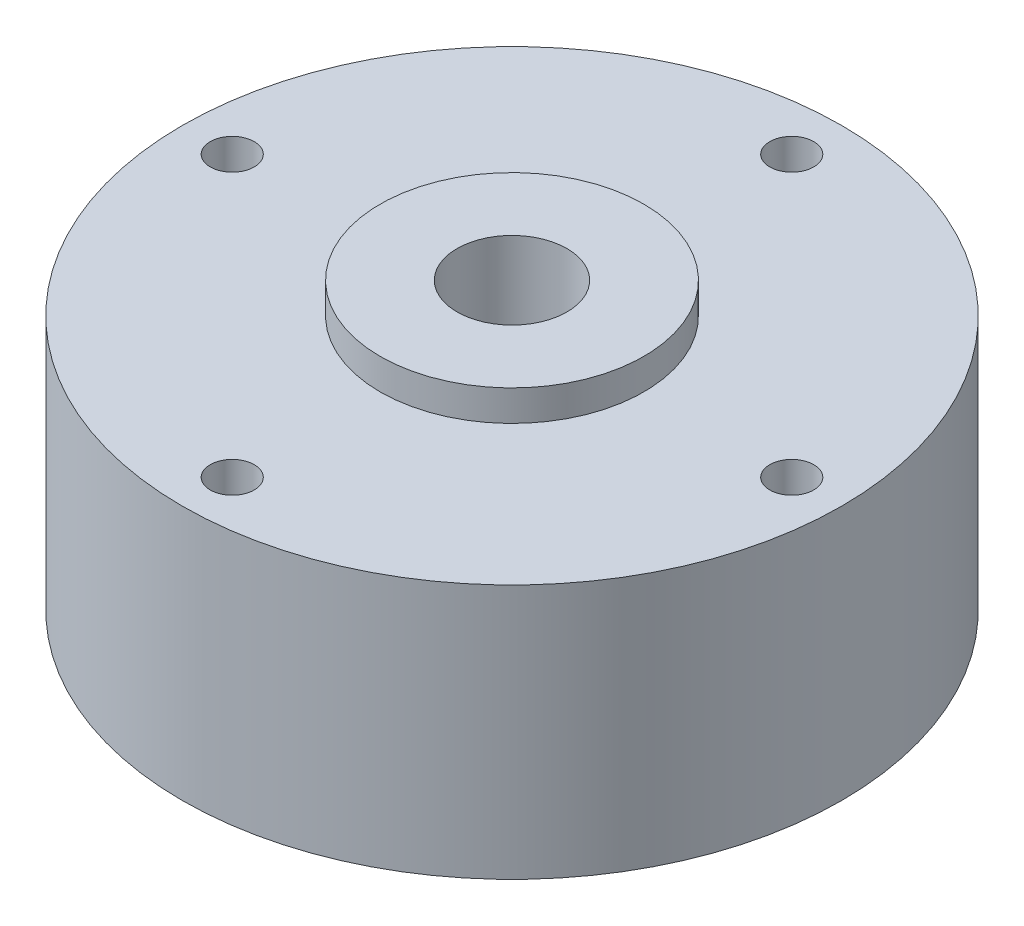
ISO-10303-21;
HEADER;
FILE_DESCRIPTION(('STEP AP214'),'2;1');
FILE_NAME('part.step','',(''),(''),'','','');
FILE_SCHEMA(('AUTOMOTIVE_DESIGN { 1 0 10303 214 1 1 1 1 }'));
ENDSEC;
DATA;
#1=APPLICATION_CONTEXT('core data for automotive mechanical design processes');
#2=APPLICATION_PROTOCOL_DEFINITION('international standard','automotive_design',2000,#1);
#3=PRODUCT_CONTEXT('',#1,'mechanical');
#4=PRODUCT('Part','Part','',(#3));
#5=PRODUCT_RELATED_PRODUCT_CATEGORY('part','',(#4));
#6=PRODUCT_DEFINITION_FORMATION('','',#4);
#7=PRODUCT_DEFINITION_CONTEXT('part definition',#1,'design');
#8=PRODUCT_DEFINITION('design','',#6,#7);
#9=PRODUCT_DEFINITION_SHAPE('','',#8);
#10=(LENGTH_UNIT() NAMED_UNIT(*) SI_UNIT(.MILLI.,.METRE.));
#11=(NAMED_UNIT(*) PLANE_ANGLE_UNIT() SI_UNIT($,.RADIAN.));
#12=(NAMED_UNIT(*) SI_UNIT($,.STERADIAN.) SOLID_ANGLE_UNIT());
#13=UNCERTAINTY_MEASURE_WITH_UNIT(LENGTH_MEASURE(1.E-05),#10,'distance_accuracy_value','');
#14=(GEOMETRIC_REPRESENTATION_CONTEXT(3) GLOBAL_UNCERTAINTY_ASSIGNED_CONTEXT((#13)) GLOBAL_UNIT_ASSIGNED_CONTEXT((#10,
#11,#12)) REPRESENTATION_CONTEXT('',''));
#15=CARTESIAN_POINT('',(0.,0.,0.));
#16=DIRECTION('',(0.,0.,1.));
#17=DIRECTION('',(1.,0.,0.));
#18=AXIS2_PLACEMENT_3D('',#15,#16,#17);
#19=CARTESIAN_POINT('',(0.,13.,0.));
#20=DIRECTION('',(0.,-1.,0.));
#21=DIRECTION('',(0.,0.,-1.));
#22=AXIS2_PLACEMENT_3D('',#19,#20,#21);
#23=CYLINDRICAL_SURFACE('',#22,15.);
#24=CARTESIAN_POINT('',(0.,0.,0.));
#25=DIRECTION('',(0.,1.,0.));
#26=DIRECTION('',(0.,0.,1.));
#27=AXIS2_PLACEMENT_3D('',#24,#25,#26);
#28=CIRCLE('',#27,15.);
#29=CARTESIAN_POINT('',(0.,0.,-15.));
#30=VERTEX_POINT('',#29);
#31=EDGE_CURVE('E10',#30,#30,#28,.T.);
#32=CARTESIAN_POINT('',(0.,11.6,0.));
#33=DIRECTION('',(0.,1.,0.));
#34=DIRECTION('',(0.,0.,1.));
#35=AXIS2_PLACEMENT_3D('',#32,#33,#34);
#36=CIRCLE('',#35,15.);
#37=CARTESIAN_POINT('',(0.,11.6,-15.));
#38=VERTEX_POINT('',#37);
#39=EDGE_CURVE('E40',#38,#38,#36,.T.);
#40=CARTESIAN_POINT('',(0.,0.,-15.));
#41=CARTESIAN_POINT('',(0.,0.120833333333333,-15.));
#42=CARTESIAN_POINT('',(0.,0.241666666666667,-15.));
#43=CARTESIAN_POINT('',(0.,0.483333333333333,-15.));
#44=CARTESIAN_POINT('',(0.,0.604166666666667,-15.));
#45=CARTESIAN_POINT('',(0.,0.845833333333333,-15.));
#46=CARTESIAN_POINT('',(0.,0.966666666666667,-15.));
#47=CARTESIAN_POINT('',(0.,1.20833333333333,-15.));
#48=CARTESIAN_POINT('',(0.,1.32916666666667,-15.));
#49=CARTESIAN_POINT('',(0.,1.57083333333333,-15.));
#50=CARTESIAN_POINT('',(0.,1.69166666666667,-15.));
#51=CARTESIAN_POINT('',(0.,1.93333333333333,-15.));
#52=CARTESIAN_POINT('',(0.,2.05416666666667,-15.));
#53=CARTESIAN_POINT('',(0.,2.29583333333333,-15.));
#54=CARTESIAN_POINT('',(0.,2.41666666666667,-15.));
#55=CARTESIAN_POINT('',(0.,2.65833333333333,-15.));
#56=CARTESIAN_POINT('',(0.,2.77916666666667,-15.));
#57=CARTESIAN_POINT('',(0.,3.02083333333333,-15.));
#58=CARTESIAN_POINT('',(0.,3.14166666666667,-15.));
#59=CARTESIAN_POINT('',(0.,3.38333333333333,-15.));
#60=CARTESIAN_POINT('',(0.,3.50416666666667,-15.));
#61=CARTESIAN_POINT('',(0.,3.74583333333333,-15.));
#62=CARTESIAN_POINT('',(0.,3.86666666666667,-15.));
#63=CARTESIAN_POINT('',(0.,4.10833333333333,-15.));
#64=CARTESIAN_POINT('',(0.,4.22916666666667,-15.));
#65=CARTESIAN_POINT('',(0.,4.47083333333333,-15.));
#66=CARTESIAN_POINT('',(0.,4.59166666666667,-15.));
#67=CARTESIAN_POINT('',(0.,4.83333333333333,-15.));
#68=CARTESIAN_POINT('',(0.,4.95416666666667,-15.));
#69=CARTESIAN_POINT('',(0.,5.19583333333333,-15.));
#70=CARTESIAN_POINT('',(0.,5.31666666666667,-15.));
#71=CARTESIAN_POINT('',(0.,5.55833333333333,-15.));
#72=CARTESIAN_POINT('',(0.,5.67916666666667,-15.));
#73=CARTESIAN_POINT('',(0.,5.92083333333333,-15.));
#74=CARTESIAN_POINT('',(0.,6.04166666666667,-15.));
#75=CARTESIAN_POINT('',(0.,6.28333333333333,-15.));
#76=CARTESIAN_POINT('',(0.,6.40416666666667,-15.));
#77=CARTESIAN_POINT('',(0.,6.64583333333333,-15.));
#78=CARTESIAN_POINT('',(0.,6.76666666666667,-15.));
#79=CARTESIAN_POINT('',(0.,7.00833333333333,-15.));
#80=CARTESIAN_POINT('',(0.,7.12916666666667,-15.));
#81=CARTESIAN_POINT('',(0.,7.37083333333333,-15.));
#82=CARTESIAN_POINT('',(0.,7.49166666666667,-15.));
#83=CARTESIAN_POINT('',(0.,7.73333333333333,-15.));
#84=CARTESIAN_POINT('',(0.,7.85416666666667,-15.));
#85=CARTESIAN_POINT('',(0.,8.09583333333333,-15.));
#86=CARTESIAN_POINT('',(0.,8.21666666666667,-15.));
#87=CARTESIAN_POINT('',(0.,8.45833333333333,-15.));
#88=CARTESIAN_POINT('',(0.,8.57916666666667,-15.));
#89=CARTESIAN_POINT('',(0.,8.82083333333333,-15.));
#90=CARTESIAN_POINT('',(0.,8.94166666666666,-15.));
#91=CARTESIAN_POINT('',(0.,9.18333333333333,-15.));
#92=CARTESIAN_POINT('',(0.,9.30416666666666,-15.));
#93=CARTESIAN_POINT('',(0.,9.54583333333333,-15.));
#94=CARTESIAN_POINT('',(0.,9.66666666666666,-15.));
#95=CARTESIAN_POINT('',(0.,9.90833333333333,-15.));
#96=CARTESIAN_POINT('',(0.,10.0291666666667,-15.));
#97=CARTESIAN_POINT('',(0.,10.2708333333333,-15.));
#98=CARTESIAN_POINT('',(0.,10.3916666666667,-15.));
#99=CARTESIAN_POINT('',(0.,10.6333333333333,-15.));
#100=CARTESIAN_POINT('',(0.,10.7541666666667,-15.));
#101=CARTESIAN_POINT('',(0.,10.9958333333333,-15.));
#102=CARTESIAN_POINT('',(0.,11.1166666666667,-15.));
#103=CARTESIAN_POINT('',(0.,11.3583333333333,-15.));
#104=CARTESIAN_POINT('',(0.,11.4791666666667,-15.));
#105=CARTESIAN_POINT('',(0.,11.6,-15.));
#106=B_SPLINE_CURVE_WITH_KNOTS('',3,(#40,#41,#42,#43,#44,#45,#46,#47,#48,#49,#50,#51,#52,#53,
#54,#55,#56,#57,#58,#59,#60,#61,#62,#63,#64,#65,#66,#67,#68,#69,#70,#71,#72,#73,#74,#75,#76,#77,
#78,#79,#80,#81,#82,#83,#84,#85,#86,#87,#88,#89,#90,#91,#92,#93,#94,#95,#96,#97,#98,#99,#100,
#101,#102,#103,#104,#105),.UNSPECIFIED.,.F.,.F.,(4,2,2,2,2,2,2,2,2,2,2,2,2,2,2,2,2,2,2,2,2,2,2,
2,2,2,2,2,2,2,2,2,4),(0.,0.3625,0.725,1.0875,1.45,1.8125,2.175,2.5375,2.9,3.2625,3.625,3.9875,
4.35,4.7125,5.075,5.4375,5.8,6.1625,6.525,6.8875,7.25,7.6125,7.975,8.3375,8.7,9.0625,9.425,
9.7875,10.15,10.5125,10.875,11.2375,11.6),.UNSPECIFIED.);
#107=EDGE_CURVE('BSEAM33',#30,#38,#106,.T.);
#108=ORIENTED_EDGE('',*,*,#31,.T.);
#109=ORIENTED_EDGE('',*,*,#39,.F.);
#110=ORIENTED_EDGE('',*,*,#107,.T.);
#111=ORIENTED_EDGE('',*,*,#107,.F.);
#112=EDGE_LOOP('',(#108,#110,#109,#111));
#113=FACE_BOUND('',#112,.T.);
#114=ADVANCED_FACE('F33',(#113),#23,.T.);
#115=CARTESIAN_POINT('',(0.,0.,0.));
#116=DIRECTION('',(0.,1.,0.));
#117=DIRECTION('',(0.,0.,1.));
#118=AXIS2_PLACEMENT_3D('',#115,#116,#117);
#119=PLANE('',#118);
#120=CARTESIAN_POINT('',(0.,0.,0.));
#121=DIRECTION('',(0.,-1.,0.));
#122=DIRECTION('',(0.,0.,-1.));
#123=AXIS2_PLACEMENT_3D('',#120,#121,#122);
#124=CIRCLE('',#123,2.5);
#125=CARTESIAN_POINT('',(0.,0.,-2.5));
#126=VERTEX_POINT('',#125);
#127=EDGE_CURVE('E105',#126,#126,#124,.T.);
#128=ORIENTED_EDGE('',*,*,#127,.F.);
#129=EDGE_LOOP('',(#128));
#130=FACE_BOUND('',#129,.T.);
#131=CARTESIAN_POINT('',(-11.,0.,-5.));
#132=DIRECTION('',(0.,-1.,0.));
#133=DIRECTION('',(0.,0.,-1.));
#134=AXIS2_PLACEMENT_3D('',#131,#132,#133);
#135=CIRCLE('',#134,1.);
#136=CARTESIAN_POINT('',(-11.,0.,-6.));
#137=VERTEX_POINT('',#136);
#138=EDGE_CURVE('E87',#137,#137,#135,.T.);
#139=ORIENTED_EDGE('',*,*,#138,.F.);
#140=EDGE_LOOP('',(#139));
#141=FACE_BOUND('',#140,.T.);
#142=CARTESIAN_POINT('',(11.,0.,-5.));
#143=DIRECTION('',(0.,-1.,0.));
#144=DIRECTION('',(0.,0.,-1.));
#145=AXIS2_PLACEMENT_3D('',#142,#143,#144);
#146=CIRCLE('',#145,1.);
#147=CARTESIAN_POINT('',(11.,0.,-6.));
#148=VERTEX_POINT('',#147);
#149=EDGE_CURVE('E94',#148,#148,#146,.T.);
#150=ORIENTED_EDGE('',*,*,#149,.F.);
#151=EDGE_LOOP('',(#150));
#152=FACE_BOUND('',#151,.T.);
#153=CARTESIAN_POINT('',(11.,0.,5.));
#154=DIRECTION('',(0.,-1.,0.));
#155=DIRECTION('',(0.,0.,-1.));
#156=AXIS2_PLACEMENT_3D('',#153,#154,#155);
#157=CIRCLE('',#156,1.);
#158=CARTESIAN_POINT('',(11.,0.,4.));
#159=VERTEX_POINT('',#158);
#160=EDGE_CURVE('E100',#159,#159,#157,.T.);
#161=ORIENTED_EDGE('',*,*,#160,.F.);
#162=EDGE_LOOP('',(#161));
#163=FACE_BOUND('',#162,.T.);
#164=CARTESIAN_POINT('',(-11.,0.,5.));
#165=DIRECTION('',(0.,-1.,0.));
#166=DIRECTION('',(0.,0.,-1.));
#167=AXIS2_PLACEMENT_3D('',#164,#165,#166);
#168=CIRCLE('',#167,1.);
#169=CARTESIAN_POINT('',(-11.,0.,4.));
#170=VERTEX_POINT('',#169);
#171=EDGE_CURVE('E81',#170,#170,#168,.T.);
#172=ORIENTED_EDGE('',*,*,#171,.F.);
#173=EDGE_LOOP('',(#172));
#174=FACE_BOUND('',#173,.T.);
#175=ORIENTED_EDGE('',*,*,#31,.F.);
#176=EDGE_LOOP('',(#175));
#177=FACE_BOUND('',#176,.T.);
#178=ADVANCED_FACE('F120',(#130,#141,#152,#163,#174,#177),#119,.F.);
#179=CARTESIAN_POINT('',(0.,11.6,0.));
#180=DIRECTION('',(0.,1.,0.));
#181=DIRECTION('',(0.,0.,1.));
#182=AXIS2_PLACEMENT_3D('',#179,#180,#181);
#183=PLANE('',#182);
#184=CARTESIAN_POINT('',(0.,11.6,-12.7279));
#185=DIRECTION('',(0.,1.,0.));
#186=DIRECTION('',(0.,0.,1.));
#187=AXIS2_PLACEMENT_3D('',#184,#185,#186);
#188=CIRCLE('',#187,1.);
#189=CARTESIAN_POINT('',(0.,11.6,-11.7279));
#190=VERTEX_POINT('',#189);
#191=EDGE_CURVE('E36',#190,#190,#188,.T.);
#192=ORIENTED_EDGE('',*,*,#191,.F.);
#193=EDGE_LOOP('',(#192));
#194=FACE_BOUND('',#193,.T.);
#195=CARTESIAN_POINT('',(12.7279,11.6,0.));
#196=DIRECTION('',(0.,1.,0.));
#197=DIRECTION('',(0.,0.,1.));
#198=AXIS2_PLACEMENT_3D('',#195,#196,#197);
#199=CIRCLE('',#198,1.);
#200=CARTESIAN_POINT('',(12.7279,11.6,1.));
#201=VERTEX_POINT('',#200);
#202=EDGE_CURVE('E55',#201,#201,#199,.T.);
#203=ORIENTED_EDGE('',*,*,#202,.F.);
#204=EDGE_LOOP('',(#203));
#205=FACE_BOUND('',#204,.T.);
#206=CARTESIAN_POINT('',(0.,11.6,12.7279));
#207=DIRECTION('',(0.,1.,0.));
#208=DIRECTION('',(0.,0.,1.));
#209=AXIS2_PLACEMENT_3D('',#206,#207,#208);
#210=CIRCLE('',#209,1.);
#211=CARTESIAN_POINT('',(0.,11.6,13.7279));
#212=VERTEX_POINT('',#211);
#213=EDGE_CURVE('E52',#212,#212,#210,.T.);
#214=ORIENTED_EDGE('',*,*,#213,.F.);
#215=EDGE_LOOP('',(#214));
#216=FACE_BOUND('',#215,.T.);
#217=CARTESIAN_POINT('',(-12.7279,11.6,0.));
#218=DIRECTION('',(0.,1.,0.));
#219=DIRECTION('',(0.,0.,1.));
#220=AXIS2_PLACEMENT_3D('',#217,#218,#219);
#221=CIRCLE('',#220,1.);
#222=CARTESIAN_POINT('',(-12.7279,11.6,1.));
#223=VERTEX_POINT('',#222);
#224=EDGE_CURVE('E49',#223,#223,#221,.T.);
#225=ORIENTED_EDGE('',*,*,#224,.F.);
#226=EDGE_LOOP('',(#225));
#227=FACE_BOUND('',#226,.T.);
#228=CARTESIAN_POINT('',(0.,11.6,0.));
#229=DIRECTION('',(0.,1.,0.));
#230=DIRECTION('',(0.,0.,1.));
#231=AXIS2_PLACEMENT_3D('',#228,#229,#230);
#232=CIRCLE('',#231,6.);
#233=CARTESIAN_POINT('',(0.,11.6,6.));
#234=VERTEX_POINT('',#233);
#235=EDGE_CURVE('E45',#234,#234,#232,.T.);
#236=ORIENTED_EDGE('',*,*,#235,.F.);
#237=EDGE_LOOP('',(#236));
#238=FACE_BOUND('',#237,.T.);
#239=ORIENTED_EDGE('',*,*,#39,.T.);
#240=EDGE_LOOP('',(#239));
#241=FACE_BOUND('',#240,.T.);
#242=ADVANCED_FACE('F123',(#194,#205,#216,#227,#238,#241),#183,.T.);
#243=CARTESIAN_POINT('',(0.,11.6,0.));
#244=DIRECTION('',(0.,1.,0.));
#245=DIRECTION('',(0.,0.,1.));
#246=AXIS2_PLACEMENT_3D('',#243,#244,#245);
#247=CYLINDRICAL_SURFACE('',#246,6.);
#248=ORIENTED_EDGE('',*,*,#235,.T.);
#249=EDGE_LOOP('',(#248));
#250=FACE_BOUND('',#249,.T.);
#251=CARTESIAN_POINT('',(0.,13.,0.));
#252=DIRECTION('',(0.,1.,0.));
#253=DIRECTION('',(0.,0.,1.));
#254=AXIS2_PLACEMENT_3D('',#251,#252,#253);
#255=CIRCLE('',#254,6.);
#256=CARTESIAN_POINT('',(0.,13.,6.));
#257=VERTEX_POINT('',#256);
#258=EDGE_CURVE('E60',#257,#257,#255,.T.);
#259=ORIENTED_EDGE('',*,*,#258,.F.);
#260=EDGE_LOOP('',(#259));
#261=FACE_BOUND('',#260,.T.);
#262=ADVANCED_FACE('F157',(#250,#261),#247,.T.);
#263=CARTESIAN_POINT('',(0.,13.,0.));
#264=DIRECTION('',(0.,1.,0.));
#265=DIRECTION('',(0.,0.,1.));
#266=AXIS2_PLACEMENT_3D('',#263,#264,#265);
#267=PLANE('',#266);
#268=CARTESIAN_POINT('',(0.,13.,0.));
#269=DIRECTION('',(0.,-1.,0.));
#270=DIRECTION('',(0.,0.,-1.));
#271=AXIS2_PLACEMENT_3D('',#268,#269,#270);
#272=CIRCLE('',#271,2.5);
#273=CARTESIAN_POINT('',(0.,13.,-2.5));
#274=VERTEX_POINT('',#273);
#275=EDGE_CURVE('E91',#274,#274,#272,.T.);
#276=ORIENTED_EDGE('',*,*,#275,.T.);
#277=EDGE_LOOP('',(#276));
#278=FACE_BOUND('',#277,.T.);
#279=ORIENTED_EDGE('',*,*,#258,.T.);
#280=EDGE_LOOP('',(#279));
#281=FACE_BOUND('',#280,.T.);
#282=ADVANCED_FACE('F111',(#278,#281),#267,.T.);
#283=CARTESIAN_POINT('',(-12.7279,8.6,0.));
#284=DIRECTION('',(0.,1.,0.));
#285=DIRECTION('',(0.,0.,1.));
#286=AXIS2_PLACEMENT_3D('',#283,#284,#285);
#287=CYLINDRICAL_SURFACE('',#286,1.);
#288=ORIENTED_EDGE('',*,*,#224,.T.);
#289=EDGE_LOOP('',(#288));
#290=FACE_BOUND('',#289,.T.);
#291=CARTESIAN_POINT('',(-12.7279,8.6,0.));
#292=DIRECTION('',(0.,1.,0.));
#293=DIRECTION('',(0.,0.,1.));
#294=AXIS2_PLACEMENT_3D('',#291,#292,#293);
#295=CIRCLE('',#294,1.);
#296=CARTESIAN_POINT('',(-12.7279,8.6,1.));
#297=VERTEX_POINT('',#296);
#298=EDGE_CURVE('E69',#297,#297,#295,.T.);
#299=ORIENTED_EDGE('',*,*,#298,.F.);
#300=EDGE_LOOP('',(#299));
#301=FACE_BOUND('',#300,.T.);
#302=ADVANCED_FACE('F169',(#290,#301),#287,.F.);
#303=CARTESIAN_POINT('',(-12.7279,8.6,0.));
#304=DIRECTION('',(0.,1.,0.));
#305=DIRECTION('',(0.,0.,1.));
#306=AXIS2_PLACEMENT_3D('',#303,#304,#305);
#307=PLANE('',#306);
#308=ORIENTED_EDGE('',*,*,#298,.T.);
#309=EDGE_LOOP('',(#308));
#310=FACE_BOUND('',#309,.T.);
#311=ADVANCED_FACE('F173',(#310),#307,.T.);
#312=CARTESIAN_POINT('',(0.,8.6,12.7279));
#313=DIRECTION('',(0.,1.,0.));
#314=DIRECTION('',(0.,0.,1.));
#315=AXIS2_PLACEMENT_3D('',#312,#313,#314);
#316=CYLINDRICAL_SURFACE('',#315,1.);
#317=ORIENTED_EDGE('',*,*,#213,.T.);
#318=EDGE_LOOP('',(#317));
#319=FACE_BOUND('',#318,.T.);
#320=CARTESIAN_POINT('',(0.,8.6,12.7279));
#321=DIRECTION('',(0.,1.,0.));
#322=DIRECTION('',(0.,0.,1.));
#323=AXIS2_PLACEMENT_3D('',#320,#321,#322);
#324=CIRCLE('',#323,1.);
#325=CARTESIAN_POINT('',(0.,8.6,13.7279));
#326=VERTEX_POINT('',#325);
#327=EDGE_CURVE('E72',#326,#326,#324,.T.);
#328=ORIENTED_EDGE('',*,*,#327,.F.);
#329=EDGE_LOOP('',(#328));
#330=FACE_BOUND('',#329,.T.);
#331=ADVANCED_FACE('F178',(#319,#330),#316,.F.);
#332=CARTESIAN_POINT('',(0.,8.6,12.7279));
#333=DIRECTION('',(0.,1.,0.));
#334=DIRECTION('',(0.,0.,1.));
#335=AXIS2_PLACEMENT_3D('',#332,#333,#334);
#336=PLANE('',#335);
#337=ORIENTED_EDGE('',*,*,#327,.T.);
#338=EDGE_LOOP('',(#337));
#339=FACE_BOUND('',#338,.T.);
#340=ADVANCED_FACE('F185',(#339),#336,.T.);
#341=CARTESIAN_POINT('',(12.7279,8.6,0.));
#342=DIRECTION('',(0.,1.,0.));
#343=DIRECTION('',(0.,0.,1.));
#344=AXIS2_PLACEMENT_3D('',#341,#342,#343);
#345=CYLINDRICAL_SURFACE('',#344,1.);
#346=ORIENTED_EDGE('',*,*,#202,.T.);
#347=EDGE_LOOP('',(#346));
#348=FACE_BOUND('',#347,.T.);
#349=CARTESIAN_POINT('',(12.7279,8.6,0.));
#350=DIRECTION('',(0.,1.,0.));
#351=DIRECTION('',(0.,0.,1.));
#352=AXIS2_PLACEMENT_3D('',#349,#350,#351);
#353=CIRCLE('',#352,1.);
#354=CARTESIAN_POINT('',(12.7279,8.6,1.));
#355=VERTEX_POINT('',#354);
#356=EDGE_CURVE('E76',#355,#355,#353,.T.);
#357=ORIENTED_EDGE('',*,*,#356,.F.);
#358=EDGE_LOOP('',(#357));
#359=FACE_BOUND('',#358,.T.);
#360=ADVANCED_FACE('F189',(#348,#359),#345,.F.);
#361=CARTESIAN_POINT('',(12.7279,8.6,0.));
#362=DIRECTION('',(0.,1.,0.));
#363=DIRECTION('',(0.,0.,1.));
#364=AXIS2_PLACEMENT_3D('',#361,#362,#363);
#365=PLANE('',#364);
#366=ORIENTED_EDGE('',*,*,#356,.T.);
#367=EDGE_LOOP('',(#366));
#368=FACE_BOUND('',#367,.T.);
#369=ADVANCED_FACE('F193',(#368),#365,.T.);
#370=CARTESIAN_POINT('',(0.,8.6,-12.7279));
#371=DIRECTION('',(0.,1.,0.));
#372=DIRECTION('',(0.,0.,1.));
#373=AXIS2_PLACEMENT_3D('',#370,#371,#372);
#374=CYLINDRICAL_SURFACE('',#373,1.);
#375=ORIENTED_EDGE('',*,*,#191,.T.);
#376=EDGE_LOOP('',(#375));
#377=FACE_BOUND('',#376,.T.);
#378=CARTESIAN_POINT('',(0.,8.6,-12.7279));
#379=DIRECTION('',(0.,1.,0.));
#380=DIRECTION('',(0.,0.,1.));
#381=AXIS2_PLACEMENT_3D('',#378,#379,#380);
#382=CIRCLE('',#381,1.);
#383=CARTESIAN_POINT('',(0.,8.6,-11.7279));
#384=VERTEX_POINT('',#383);
#385=EDGE_CURVE('E53',#384,#384,#382,.T.);
#386=ORIENTED_EDGE('',*,*,#385,.F.);
#387=EDGE_LOOP('',(#386));
#388=FACE_BOUND('',#387,.T.);
#389=ADVANCED_FACE('F146',(#377,#388),#374,.F.);
#390=CARTESIAN_POINT('',(0.,8.6,-12.7279));
#391=DIRECTION('',(0.,1.,0.));
#392=DIRECTION('',(0.,0.,1.));
#393=AXIS2_PLACEMENT_3D('',#390,#391,#392);
#394=PLANE('',#393);
#395=ORIENTED_EDGE('',*,*,#385,.T.);
#396=EDGE_LOOP('',(#395));
#397=FACE_BOUND('',#396,.T.);
#398=ADVANCED_FACE('F136',(#397),#394,.T.);
#399=CARTESIAN_POINT('',(-11.,3.,5.));
#400=DIRECTION('',(0.,-1.,0.));
#401=DIRECTION('',(0.,0.,-1.));
#402=AXIS2_PLACEMENT_3D('',#399,#400,#401);
#403=CYLINDRICAL_SURFACE('',#402,1.);
#404=CARTESIAN_POINT('',(-11.,3.,5.));
#405=DIRECTION('',(0.,-1.,0.));
#406=DIRECTION('',(0.,0.,-1.));
#407=AXIS2_PLACEMENT_3D('',#404,#405,#406);
#408=CIRCLE('',#407,1.);
#409=CARTESIAN_POINT('',(-11.,3.,4.));
#410=VERTEX_POINT('',#409);
#411=EDGE_CURVE('E73',#410,#410,#408,.T.);
#412=ORIENTED_EDGE('',*,*,#411,.F.);
#413=EDGE_LOOP('',(#412));
#414=FACE_BOUND('',#413,.T.);
#415=ORIENTED_EDGE('',*,*,#171,.T.);
#416=EDGE_LOOP('',(#415));
#417=FACE_BOUND('',#416,.T.);
#418=ADVANCED_FACE('F133',(#414,#417),#403,.F.);
#419=CARTESIAN_POINT('',(-11.,3.,5.));
#420=DIRECTION('',(0.,-1.,0.));
#421=DIRECTION('',(0.,0.,-1.));
#422=AXIS2_PLACEMENT_3D('',#419,#420,#421);
#423=PLANE('',#422);
#424=ORIENTED_EDGE('',*,*,#411,.T.);
#425=EDGE_LOOP('',(#424));
#426=FACE_BOUND('',#425,.T.);
#427=ADVANCED_FACE('F135',(#426),#423,.T.);
#428=CARTESIAN_POINT('',(11.,3.,5.));
#429=DIRECTION('',(0.,-1.,0.));
#430=DIRECTION('',(0.,0.,-1.));
#431=AXIS2_PLACEMENT_3D('',#428,#429,#430);
#432=CYLINDRICAL_SURFACE('',#431,1.);
#433=CARTESIAN_POINT('',(11.,3.,5.));
#434=DIRECTION('',(0.,-1.,0.));
#435=DIRECTION('',(0.,0.,-1.));
#436=AXIS2_PLACEMENT_3D('',#433,#434,#435);
#437=CIRCLE('',#436,1.);
#438=CARTESIAN_POINT('',(11.,3.,4.));
#439=VERTEX_POINT('',#438);
#440=EDGE_CURVE('E84',#439,#439,#437,.T.);
#441=ORIENTED_EDGE('',*,*,#440,.F.);
#442=EDGE_LOOP('',(#441));
#443=FACE_BOUND('',#442,.T.);
#444=ORIENTED_EDGE('',*,*,#160,.T.);
#445=EDGE_LOOP('',(#444));
#446=FACE_BOUND('',#445,.T.);
#447=ADVANCED_FACE('F143',(#443,#446),#432,.F.);
#448=CARTESIAN_POINT('',(11.,3.,5.));
#449=DIRECTION('',(0.,-1.,0.));
#450=DIRECTION('',(0.,0.,-1.));
#451=AXIS2_PLACEMENT_3D('',#448,#449,#450);
#452=PLANE('',#451);
#453=ORIENTED_EDGE('',*,*,#440,.T.);
#454=EDGE_LOOP('',(#453));
#455=FACE_BOUND('',#454,.T.);
#456=ADVANCED_FACE('F227',(#455),#452,.T.);
#457=CARTESIAN_POINT('',(11.,3.,-5.));
#458=DIRECTION('',(0.,-1.,0.));
#459=DIRECTION('',(0.,0.,-1.));
#460=AXIS2_PLACEMENT_3D('',#457,#458,#459);
#461=CYLINDRICAL_SURFACE('',#460,1.);
#462=CARTESIAN_POINT('',(11.,3.,-5.));
#463=DIRECTION('',(0.,-1.,0.));
#464=DIRECTION('',(0.,0.,-1.));
#465=AXIS2_PLACEMENT_3D('',#462,#463,#464);
#466=CIRCLE('',#465,1.);
#467=CARTESIAN_POINT('',(11.,3.,-6.));
#468=VERTEX_POINT('',#467);
#469=EDGE_CURVE('E97',#468,#468,#466,.T.);
#470=ORIENTED_EDGE('',*,*,#469,.F.);
#471=EDGE_LOOP('',(#470));
#472=FACE_BOUND('',#471,.T.);
#473=ORIENTED_EDGE('',*,*,#149,.T.);
#474=EDGE_LOOP('',(#473));
#475=FACE_BOUND('',#474,.T.);
#476=ADVANCED_FACE('F237',(#472,#475),#461,.F.);
#477=CARTESIAN_POINT('',(11.,3.,-5.));
#478=DIRECTION('',(0.,-1.,0.));
#479=DIRECTION('',(0.,0.,-1.));
#480=AXIS2_PLACEMENT_3D('',#477,#478,#479);
#481=PLANE('',#480);
#482=ORIENTED_EDGE('',*,*,#469,.T.);
#483=EDGE_LOOP('',(#482));
#484=FACE_BOUND('',#483,.T.);
#485=ADVANCED_FACE('F247',(#484),#481,.T.);
#486=CARTESIAN_POINT('',(-11.,3.,-5.));
#487=DIRECTION('',(0.,-1.,0.));
#488=DIRECTION('',(0.,0.,-1.));
#489=AXIS2_PLACEMENT_3D('',#486,#487,#488);
#490=CYLINDRICAL_SURFACE('',#489,1.);
#491=CARTESIAN_POINT('',(-11.,3.,-5.));
#492=DIRECTION('',(0.,-1.,0.));
#493=DIRECTION('',(0.,0.,-1.));
#494=AXIS2_PLACEMENT_3D('',#491,#492,#493);
#495=CIRCLE('',#494,1.);
#496=CARTESIAN_POINT('',(-11.,3.,-6.));
#497=VERTEX_POINT('',#496);
#498=EDGE_CURVE('E90',#497,#497,#495,.T.);
#499=ORIENTED_EDGE('',*,*,#498,.F.);
#500=EDGE_LOOP('',(#499));
#501=FACE_BOUND('',#500,.T.);
#502=ORIENTED_EDGE('',*,*,#138,.T.);
#503=EDGE_LOOP('',(#502));
#504=FACE_BOUND('',#503,.T.);
#505=ADVANCED_FACE('F257',(#501,#504),#490,.F.);
#506=CARTESIAN_POINT('',(-11.,3.,-5.));
#507=DIRECTION('',(0.,-1.,0.));
#508=DIRECTION('',(0.,0.,-1.));
#509=AXIS2_PLACEMENT_3D('',#506,#507,#508);
#510=PLANE('',#509);
#511=ORIENTED_EDGE('',*,*,#498,.T.);
#512=EDGE_LOOP('',(#511));
#513=FACE_BOUND('',#512,.T.);
#514=ADVANCED_FACE('F116',(#513),#510,.T.);
#515=CARTESIAN_POINT('',(0.,13.,0.));
#516=DIRECTION('',(0.,-1.,0.));
#517=DIRECTION('',(0.,0.,-1.));
#518=AXIS2_PLACEMENT_3D('',#515,#516,#517);
#519=CYLINDRICAL_SURFACE('',#518,2.5);
#520=CARTESIAN_POINT('',(0.,13.,-2.5));
#521=CARTESIAN_POINT('',(0.,12.8645833333333,-2.5));
#522=CARTESIAN_POINT('',(0.,12.7291666666667,-2.5));
#523=CARTESIAN_POINT('',(0.,12.4583333333333,-2.5));
#524=CARTESIAN_POINT('',(0.,12.3229166666667,-2.5));
#525=CARTESIAN_POINT('',(0.,12.0520833333333,-2.5));
#526=CARTESIAN_POINT('',(0.,11.9166666666667,-2.5));
#527=CARTESIAN_POINT('',(0.,11.6458333333333,-2.5));
#528=CARTESIAN_POINT('',(0.,11.5104166666667,-2.5));
#529=CARTESIAN_POINT('',(0.,11.2395833333333,-2.5));
#530=CARTESIAN_POINT('',(0.,11.1041666666667,-2.5));
#531=CARTESIAN_POINT('',(0.,10.8333333333333,-2.5));
#532=CARTESIAN_POINT('',(0.,10.6979166666667,-2.5));
#533=CARTESIAN_POINT('',(0.,10.4270833333333,-2.5));
#534=CARTESIAN_POINT('',(0.,10.2916666666667,-2.5));
#535=CARTESIAN_POINT('',(0.,10.0208333333333,-2.5));
#536=CARTESIAN_POINT('',(0.,9.88541666666667,-2.5));
#537=CARTESIAN_POINT('',(0.,9.61458333333333,-2.5));
#538=CARTESIAN_POINT('',(0.,9.47916666666667,-2.5));
#539=CARTESIAN_POINT('',(0.,9.20833333333333,-2.5));
#540=CARTESIAN_POINT('',(0.,9.07291666666667,-2.5));
#541=CARTESIAN_POINT('',(0.,8.80208333333333,-2.5));
#542=CARTESIAN_POINT('',(0.,8.66666666666667,-2.5));
#543=CARTESIAN_POINT('',(0.,8.39583333333333,-2.5));
#544=CARTESIAN_POINT('',(0.,8.26041666666667,-2.5));
#545=CARTESIAN_POINT('',(0.,7.98958333333333,-2.5));
#546=CARTESIAN_POINT('',(0.,7.85416666666667,-2.5));
#547=CARTESIAN_POINT('',(0.,7.58333333333333,-2.5));
#548=CARTESIAN_POINT('',(0.,7.44791666666667,-2.5));
#549=CARTESIAN_POINT('',(0.,7.17708333333333,-2.5));
#550=CARTESIAN_POINT('',(0.,7.04166666666667,-2.5));
#551=CARTESIAN_POINT('',(0.,6.77083333333333,-2.5));
#552=CARTESIAN_POINT('',(0.,6.63541666666667,-2.5));
#553=CARTESIAN_POINT('',(0.,6.36458333333333,-2.5));
#554=CARTESIAN_POINT('',(0.,6.22916666666667,-2.5));
#555=CARTESIAN_POINT('',(0.,5.95833333333333,-2.5));
#556=CARTESIAN_POINT('',(0.,5.82291666666667,-2.5));
#557=CARTESIAN_POINT('',(0.,5.55208333333333,-2.5));
#558=CARTESIAN_POINT('',(0.,5.41666666666667,-2.5));
#559=CARTESIAN_POINT('',(0.,5.14583333333333,-2.5));
#560=CARTESIAN_POINT('',(0.,5.01041666666667,-2.5));
#561=CARTESIAN_POINT('',(0.,4.73958333333333,-2.5));
#562=CARTESIAN_POINT('',(0.,4.60416666666667,-2.5));
#563=CARTESIAN_POINT('',(0.,4.33333333333333,-2.5));
#564=CARTESIAN_POINT('',(0.,4.19791666666667,-2.5));
#565=CARTESIAN_POINT('',(0.,3.92708333333333,-2.5));
#566=CARTESIAN_POINT('',(0.,3.79166666666667,-2.5));
#567=CARTESIAN_POINT('',(0.,3.52083333333333,-2.5));
#568=CARTESIAN_POINT('',(0.,3.38541666666667,-2.5));
#569=CARTESIAN_POINT('',(0.,3.11458333333333,-2.5));
#570=CARTESIAN_POINT('',(0.,2.97916666666667,-2.5));
#571=CARTESIAN_POINT('',(0.,2.70833333333333,-2.5));
#572=CARTESIAN_POINT('',(0.,2.57291666666667,-2.5));
#573=CARTESIAN_POINT('',(0.,2.30208333333333,-2.5));
#574=CARTESIAN_POINT('',(0.,2.16666666666667,-2.5));
#575=CARTESIAN_POINT('',(0.,1.89583333333333,-2.5));
#576=CARTESIAN_POINT('',(0.,1.76041666666667,-2.5));
#577=CARTESIAN_POINT('',(0.,1.48958333333333,-2.5));
#578=CARTESIAN_POINT('',(0.,1.35416666666667,-2.5));
#579=CARTESIAN_POINT('',(0.,1.08333333333333,-2.5));
#580=CARTESIAN_POINT('',(0.,0.947916666666667,-2.5));
#581=CARTESIAN_POINT('',(0.,0.677083333333334,-2.5));
#582=CARTESIAN_POINT('',(0.,0.541666666666667,-2.5));
#583=CARTESIAN_POINT('',(0.,0.270833333333334,-2.5));
#584=CARTESIAN_POINT('',(0.,0.135416666666667,-2.5));
#585=CARTESIAN_POINT('',(0.,0.,-2.5));
#586=B_SPLINE_CURVE_WITH_KNOTS('',3,(#520,#521,#522,#523,#524,#525,#526,#527,#528,#529,#530,
#531,#532,#533,#534,#535,#536,#537,#538,#539,#540,#541,#542,#543,#544,#545,#546,#547,#548,#549,
#550,#551,#552,#553,#554,#555,#556,#557,#558,#559,#560,#561,#562,#563,#564,#565,#566,#567,#568,
#569,#570,#571,#572,#573,#574,#575,#576,#577,#578,#579,#580,#581,#582,#583,#584,#585),
.UNSPECIFIED.,.F.,.F.,(4,2,2,2,2,2,2,2,2,2,2,2,2,2,2,2,2,2,2,2,2,2,2,2,2,2,2,2,2,2,2,2,4),(0.,
0.406249999999999,0.812499999999999,1.21875,1.625,2.03125,2.4375,2.84375,3.25,3.65625,4.0625,
4.46875,4.875,5.28125,5.6875,6.09375,6.5,6.90625,7.3125,7.71875,8.125,8.53125,8.9375,9.34375,
9.75,10.15625,10.5625,10.96875,11.375,11.78125,12.1875,12.59375,13.),.UNSPECIFIED.);
#587=EDGE_CURVE('BSEAM113',#274,#126,#586,.T.);
#588=ORIENTED_EDGE('',*,*,#275,.F.);
#589=ORIENTED_EDGE('',*,*,#127,.T.);
#590=ORIENTED_EDGE('',*,*,#587,.T.);
#591=ORIENTED_EDGE('',*,*,#587,.F.);
#592=EDGE_LOOP('',(#588,#590,#589,#591));
#593=FACE_BOUND('',#592,.T.);
#594=ADVANCED_FACE('F113',(#593),#519,.F.);
#595=CLOSED_SHELL('',(#114,#178,#242,#262,#282,#302,#311,#331,#340,#360,#369,#389,#398,#418,
#427,#447,#456,#476,#485,#505,#514,#594));
#596=MANIFOLD_SOLID_BREP('B2',#595);
#597=ADVANCED_BREP_SHAPE_REPRESENTATION('',(#18,#596),#14);
#598=SHAPE_DEFINITION_REPRESENTATION(#9,#597);
ENDSEC;
END-ISO-10303-21;
